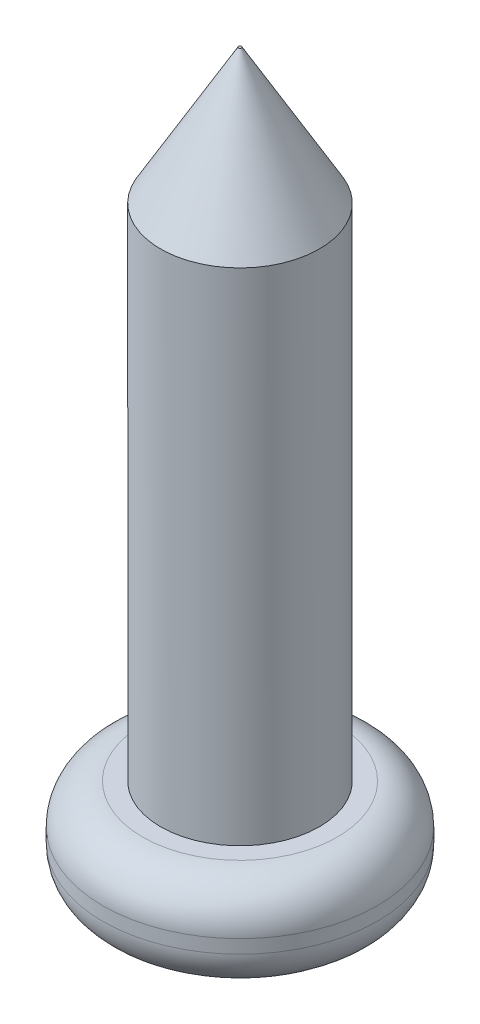
ISO-10303-21;
HEADER;
FILE_DESCRIPTION(('STEP AP214'),'2;1');
FILE_NAME('part.step','',(''),(''),'','','');
FILE_SCHEMA(('AUTOMOTIVE_DESIGN { 1 0 10303 214 1 1 1 1 }'));
ENDSEC;
DATA;
#1=APPLICATION_CONTEXT('core data for automotive mechanical design processes');
#2=APPLICATION_PROTOCOL_DEFINITION('international standard','automotive_design',2000,#1);
#3=PRODUCT_CONTEXT('',#1,'mechanical');
#4=PRODUCT('Part','Part','',(#3));
#5=PRODUCT_RELATED_PRODUCT_CATEGORY('part','',(#4));
#6=PRODUCT_DEFINITION_FORMATION('','',#4);
#7=PRODUCT_DEFINITION_CONTEXT('part definition',#1,'design');
#8=PRODUCT_DEFINITION('design','',#6,#7);
#9=PRODUCT_DEFINITION_SHAPE('','',#8);
#10=(LENGTH_UNIT() NAMED_UNIT(*) SI_UNIT(.MILLI.,.METRE.));
#11=(NAMED_UNIT(*) PLANE_ANGLE_UNIT() SI_UNIT($,.RADIAN.));
#12=(NAMED_UNIT(*) SI_UNIT($,.STERADIAN.) SOLID_ANGLE_UNIT());
#13=UNCERTAINTY_MEASURE_WITH_UNIT(LENGTH_MEASURE(1.E-05),#10,'distance_accuracy_value','');
#14=(GEOMETRIC_REPRESENTATION_CONTEXT(3) GLOBAL_UNCERTAINTY_ASSIGNED_CONTEXT((#13)) GLOBAL_UNIT_ASSIGNED_CONTEXT((#10,
#11,#12)) REPRESENTATION_CONTEXT('',''));
#15=CARTESIAN_POINT('',(0.,0.,0.));
#16=DIRECTION('',(0.,0.,1.));
#17=DIRECTION('',(1.,0.,0.));
#18=AXIS2_PLACEMENT_3D('',#15,#16,#17);
#19=CARTESIAN_POINT('',(0.,1.17,0.));
#20=DIRECTION('',(0.,-1.,0.));
#21=DIRECTION('',(0.,0.,-1.));
#22=AXIS2_PLACEMENT_3D('',#19,#20,#21);
#23=CYLINDRICAL_SURFACE('',#22,1.725);
#24=CARTESIAN_POINT('',(0.,0.5,0.));
#25=DIRECTION('',(0.,1.,0.));
#26=DIRECTION('',(0.,0.,1.));
#27=AXIS2_PLACEMENT_3D('',#24,#25,#26);
#28=CIRCLE('',#27,1.725);
#29=CARTESIAN_POINT('',(0.,0.5,-1.725));
#30=VERTEX_POINT('',#29);
#31=EDGE_CURVE('E54',#30,#30,#28,.T.);
#32=CARTESIAN_POINT('',(0.,0.67,0.));
#33=DIRECTION('',(0.,1.,0.));
#34=DIRECTION('',(0.,0.,1.));
#35=AXIS2_PLACEMENT_3D('',#32,#33,#34);
#36=CIRCLE('',#35,1.725);
#37=CARTESIAN_POINT('',(0.,0.67,-1.725));
#38=VERTEX_POINT('',#37);
#39=EDGE_CURVE('E57',#38,#38,#36,.F.);
#40=CARTESIAN_POINT('',(0.,0.5,-1.725));
#41=CARTESIAN_POINT('',(0.,0.501770833333333,-1.725));
#42=CARTESIAN_POINT('',(0.,0.503541666666667,-1.725));
#43=CARTESIAN_POINT('',(0.,0.507083333333333,-1.725));
#44=CARTESIAN_POINT('',(0.,0.508854166666667,-1.725));
#45=CARTESIAN_POINT('',(0.,0.512395833333333,-1.725));
#46=CARTESIAN_POINT('',(0.,0.514166666666667,-1.725));
#47=CARTESIAN_POINT('',(0.,0.517708333333333,-1.725));
#48=CARTESIAN_POINT('',(0.,0.519479166666667,-1.725));
#49=CARTESIAN_POINT('',(0.,0.523020833333333,-1.725));
#50=CARTESIAN_POINT('',(0.,0.524791666666667,-1.725));
#51=CARTESIAN_POINT('',(0.,0.528333333333333,-1.725));
#52=CARTESIAN_POINT('',(0.,0.530104166666667,-1.725));
#53=CARTESIAN_POINT('',(0.,0.533645833333333,-1.725));
#54=CARTESIAN_POINT('',(0.,0.535416666666667,-1.725));
#55=CARTESIAN_POINT('',(0.,0.538958333333333,-1.725));
#56=CARTESIAN_POINT('',(0.,0.540729166666667,-1.725));
#57=CARTESIAN_POINT('',(0.,0.544270833333333,-1.725));
#58=CARTESIAN_POINT('',(0.,0.546041666666667,-1.725));
#59=CARTESIAN_POINT('',(0.,0.549583333333333,-1.725));
#60=CARTESIAN_POINT('',(0.,0.551354166666667,-1.725));
#61=CARTESIAN_POINT('',(0.,0.554895833333333,-1.725));
#62=CARTESIAN_POINT('',(0.,0.556666666666667,-1.725));
#63=CARTESIAN_POINT('',(0.,0.560208333333333,-1.725));
#64=CARTESIAN_POINT('',(0.,0.561979166666667,-1.725));
#65=CARTESIAN_POINT('',(0.,0.565520833333333,-1.725));
#66=CARTESIAN_POINT('',(0.,0.567291666666667,-1.725));
#67=CARTESIAN_POINT('',(0.,0.570833333333333,-1.725));
#68=CARTESIAN_POINT('',(0.,0.572604166666667,-1.725));
#69=CARTESIAN_POINT('',(0.,0.576145833333333,-1.725));
#70=CARTESIAN_POINT('',(0.,0.577916666666667,-1.725));
#71=CARTESIAN_POINT('',(0.,0.581458333333333,-1.725));
#72=CARTESIAN_POINT('',(0.,0.583229166666667,-1.725));
#73=CARTESIAN_POINT('',(0.,0.586770833333333,-1.725));
#74=CARTESIAN_POINT('',(0.,0.588541666666667,-1.725));
#75=CARTESIAN_POINT('',(0.,0.592083333333333,-1.725));
#76=CARTESIAN_POINT('',(0.,0.593854166666667,-1.725));
#77=CARTESIAN_POINT('',(0.,0.597395833333333,-1.725));
#78=CARTESIAN_POINT('',(0.,0.599166666666667,-1.725));
#79=CARTESIAN_POINT('',(0.,0.602708333333333,-1.725));
#80=CARTESIAN_POINT('',(0.,0.604479166666667,-1.725));
#81=CARTESIAN_POINT('',(0.,0.608020833333333,-1.725));
#82=CARTESIAN_POINT('',(0.,0.609791666666667,-1.725));
#83=CARTESIAN_POINT('',(0.,0.613333333333333,-1.725));
#84=CARTESIAN_POINT('',(0.,0.615104166666667,-1.725));
#85=CARTESIAN_POINT('',(0.,0.618645833333333,-1.725));
#86=CARTESIAN_POINT('',(0.,0.620416666666667,-1.725));
#87=CARTESIAN_POINT('',(0.,0.623958333333333,-1.725));
#88=CARTESIAN_POINT('',(0.,0.625729166666667,-1.725));
#89=CARTESIAN_POINT('',(0.,0.629270833333333,-1.725));
#90=CARTESIAN_POINT('',(0.,0.631041666666667,-1.725));
#91=CARTESIAN_POINT('',(0.,0.634583333333333,-1.725));
#92=CARTESIAN_POINT('',(0.,0.636354166666667,-1.725));
#93=CARTESIAN_POINT('',(0.,0.639895833333333,-1.725));
#94=CARTESIAN_POINT('',(0.,0.641666666666667,-1.725));
#95=CARTESIAN_POINT('',(0.,0.645208333333333,-1.725));
#96=CARTESIAN_POINT('',(0.,0.646979166666667,-1.725));
#97=CARTESIAN_POINT('',(0.,0.650520833333333,-1.725));
#98=CARTESIAN_POINT('',(0.,0.652291666666667,-1.725));
#99=CARTESIAN_POINT('',(0.,0.655833333333333,-1.725));
#100=CARTESIAN_POINT('',(0.,0.657604166666667,-1.725));
#101=CARTESIAN_POINT('',(0.,0.661145833333333,-1.725));
#102=CARTESIAN_POINT('',(0.,0.662916666666667,-1.725));
#103=CARTESIAN_POINT('',(0.,0.666458333333333,-1.725));
#104=CARTESIAN_POINT('',(0.,0.668229166666667,-1.725));
#105=CARTESIAN_POINT('',(0.,0.67,-1.725));
#106=B_SPLINE_CURVE_WITH_KNOTS('',3,(#40,#41,#42,#43,#44,#45,#46,#47,#48,#49,#50,#51,#52,#53,
#54,#55,#56,#57,#58,#59,#60,#61,#62,#63,#64,#65,#66,#67,#68,#69,#70,#71,#72,#73,#74,#75,#76,#77,
#78,#79,#80,#81,#82,#83,#84,#85,#86,#87,#88,#89,#90,#91,#92,#93,#94,#95,#96,#97,#98,#99,#100,
#101,#102,#103,#104,#105),.UNSPECIFIED.,.F.,.F.,(4,2,2,2,2,2,2,2,2,2,2,2,2,2,2,2,2,2,2,2,2,2,2,
2,2,2,2,2,2,2,2,2,4),(0.,0.0053125,0.010625,0.0159375,0.02125,0.0265625,0.031875,0.0371875,
0.0425,0.0478125,0.053125,0.0584375,0.06375,0.0690625,0.074375,0.0796875,0.085,0.0903125,
0.095625,0.1009375,0.10625,0.1115625,0.116875,0.1221875,0.1275,0.1328125,0.138125,0.1434375,
0.14875,0.1540625,0.159375,0.1646875,0.17),.UNSPECIFIED.);
#107=EDGE_CURVE('BSEAM33',#30,#38,#106,.T.);
#108=ORIENTED_EDGE('',*,*,#31,.T.);
#109=ORIENTED_EDGE('',*,*,#39,.T.);
#110=ORIENTED_EDGE('',*,*,#107,.T.);
#111=ORIENTED_EDGE('',*,*,#107,.F.);
#112=EDGE_LOOP('',(#108,#110,#109,#111));
#113=FACE_BOUND('',#112,.T.);
#114=ADVANCED_FACE('F33',(#113),#23,.T.);
#115=CARTESIAN_POINT('',(0.,1.17,0.));
#116=DIRECTION('',(0.,1.,0.));
#117=DIRECTION('',(0.,0.,1.));
#118=AXIS2_PLACEMENT_3D('',#115,#116,#117);
#119=PLANE('',#118);
#120=CARTESIAN_POINT('',(0.,1.17,0.));
#121=DIRECTION('',(0.,1.,0.));
#122=DIRECTION('',(0.,0.,1.));
#123=AXIS2_PLACEMENT_3D('',#120,#121,#122);
#124=CIRCLE('',#123,1.);
#125=CARTESIAN_POINT('',(0.,1.17,1.));
#126=VERTEX_POINT('',#125);
#127=EDGE_CURVE('E60',#126,#126,#124,.T.);
#128=ORIENTED_EDGE('',*,*,#127,.F.);
#129=EDGE_LOOP('',(#128));
#130=FACE_BOUND('',#129,.T.);
#131=CARTESIAN_POINT('',(0.,1.17,0.));
#132=DIRECTION('',(0.,1.,0.));
#133=DIRECTION('',(0.,0.,1.));
#134=AXIS2_PLACEMENT_3D('',#131,#132,#133);
#135=CIRCLE('',#134,1.225);
#136=CARTESIAN_POINT('',(0.,1.17,1.225));
#137=VERTEX_POINT('',#136);
#138=EDGE_CURVE('E45',#137,#137,#135,.T.);
#139=ORIENTED_EDGE('',*,*,#138,.T.);
#140=EDGE_LOOP('',(#139));
#141=FACE_BOUND('',#140,.T.);
#142=ADVANCED_FACE('F66',(#130,#141),#119,.T.);
#143=CARTESIAN_POINT('',(0.,0.,0.));
#144=DIRECTION('',(0.,1.,0.));
#145=DIRECTION('',(0.,0.,1.));
#146=AXIS2_PLACEMENT_3D('',#143,#144,#145);
#147=PLANE('',#146);
#148=CARTESIAN_POINT('',(0.,0.,0.));
#149=DIRECTION('',(0.,1.,0.));
#150=DIRECTION('',(0.,0.,1.));
#151=AXIS2_PLACEMENT_3D('',#148,#149,#150);
#152=CIRCLE('',#151,1.225);
#153=CARTESIAN_POINT('',(0.,0.,1.225));
#154=VERTEX_POINT('',#153);
#155=EDGE_CURVE('E49',#154,#154,#152,.F.);
#156=ORIENTED_EDGE('',*,*,#155,.T.);
#157=EDGE_LOOP('',(#156));
#158=FACE_BOUND('',#157,.T.);
#159=ADVANCED_FACE('F69',(#158),#147,.F.);
#160=CARTESIAN_POINT('',(0.,0.5,0.));
#161=DIRECTION('',(0.,1.,0.));
#162=DIRECTION('',(0.,0.,1.));
#163=AXIS2_PLACEMENT_3D('',#160,#161,#162);
#164=TOROIDAL_SURFACE('',#163,1.225,0.5);
#165=ORIENTED_EDGE('',*,*,#155,.F.);
#166=EDGE_LOOP('',(#165));
#167=FACE_BOUND('',#166,.T.);
#168=ORIENTED_EDGE('',*,*,#31,.F.);
#169=EDGE_LOOP('',(#168));
#170=FACE_BOUND('',#169,.T.);
#171=ADVANCED_FACE('F75',(#167,#170),#164,.T.);
#172=CARTESIAN_POINT('',(0.,0.67,0.));
#173=DIRECTION('',(0.,1.,0.));
#174=DIRECTION('',(0.,0.,1.));
#175=AXIS2_PLACEMENT_3D('',#172,#173,#174);
#176=TOROIDAL_SURFACE('',#175,1.225,0.5);
#177=ORIENTED_EDGE('',*,*,#39,.F.);
#178=EDGE_LOOP('',(#177));
#179=FACE_BOUND('',#178,.T.);
#180=ORIENTED_EDGE('',*,*,#138,.F.);
#181=EDGE_LOOP('',(#180));
#182=FACE_BOUND('',#181,.T.);
#183=ADVANCED_FACE('F73',(#179,#182),#176,.T.);
#184=CARTESIAN_POINT('',(0.,9.17,0.));
#185=DIRECTION('',(0.,-1.,0.));
#186=DIRECTION('',(0.,0.,-1.));
#187=AXIS2_PLACEMENT_3D('',#184,#185,#186);
#188=CYLINDRICAL_SURFACE('',#187,1.);
#189=CARTESIAN_POINT('',(0.,7.46999999999999,0.));
#190=DIRECTION('',(0.,1.,0.));
#191=DIRECTION('',(0.,0.,1.));
#192=AXIS2_PLACEMENT_3D('',#189,#190,#191);
#193=CIRCLE('',#192,1.);
#194=CARTESIAN_POINT('',(0.,7.46999999999999,-1.));
#195=VERTEX_POINT('',#194);
#196=EDGE_CURVE('E10',#195,#195,#193,.F.);
#197=ORIENTED_EDGE('',*,*,#196,.T.);
#198=EDGE_LOOP('',(#197));
#199=FACE_BOUND('',#198,.T.);
#200=ORIENTED_EDGE('',*,*,#127,.T.);
#201=EDGE_LOOP('',(#200));
#202=FACE_BOUND('',#201,.T.);
#203=ADVANCED_FACE('F64',(#199,#202),#188,.T.);
#204=CARTESIAN_POINT('',(0.,9.17,0.));
#205=DIRECTION('',(0.,1.,0.));
#206=DIRECTION('',(0.,0.,1.));
#207=AXIS2_PLACEMENT_3D('',#204,#205,#206);
#208=PLANE('',#207);
#209=CARTESIAN_POINT('',(0.,9.17,0.));
#210=DIRECTION('',(0.,1.,0.));
#211=DIRECTION('',(0.,0.,1.));
#212=AXIS2_PLACEMENT_3D('',#209,#210,#211);
#213=CIRCLE('',#212,0.0185045423776349);
#214=CARTESIAN_POINT('',(0.,9.17,-0.0185045423776354));
#215=VERTEX_POINT('',#214);
#216=EDGE_CURVE('E41',#215,#215,#213,.T.);
#217=ORIENTED_EDGE('',*,*,#216,.T.);
#218=EDGE_LOOP('',(#217));
#219=FACE_BOUND('',#218,.T.);
#220=ADVANCED_FACE('F81',(#219),#208,.T.);
#221=CARTESIAN_POINT('',(0.,9.17,0.));
#222=DIRECTION('',(0.,-1.,0.));
#223=DIRECTION('',(0.,0.,-1.));
#224=AXIS2_PLACEMENT_3D('',#221,#222,#223);
#225=CONICAL_SURFACE('',#224,0.0185045423776349,0.523598775598297);
#226=CARTESIAN_POINT('',(0.,7.46999999999999,-1.));
#227=CARTESIAN_POINT('',(0.,7.48770833333332,-0.989776088983101));
#228=CARTESIAN_POINT('',(0.,7.50541666666666,-0.979552177966201));
#229=CARTESIAN_POINT('',(0.,7.54083333333332,-0.959104355932402));
#230=CARTESIAN_POINT('',(0.,7.55854166666666,-0.948880444915502));
#231=CARTESIAN_POINT('',(0.,7.59395833333332,-0.928432622881703));
#232=CARTESIAN_POINT('',(0.,7.61166666666666,-0.918208711864803));
#233=CARTESIAN_POINT('',(0.,7.64708333333332,-0.897760889831004));
#234=CARTESIAN_POINT('',(0.,7.66479166666666,-0.887536978814104));
#235=CARTESIAN_POINT('',(0.,7.70020833333332,-0.867089156780305));
#236=CARTESIAN_POINT('',(0.,7.71791666666666,-0.856865245763405));
#237=CARTESIAN_POINT('',(0.,7.75333333333332,-0.836417423729606));
#238=CARTESIAN_POINT('',(0.,7.77104166666666,-0.826193512712706));
#239=CARTESIAN_POINT('',(0.,7.80645833333332,-0.805745690678907));
#240=CARTESIAN_POINT('',(0.,7.82416666666666,-0.795521779662007));
#241=CARTESIAN_POINT('',(0.,7.85958333333332,-0.775073957628208));
#242=CARTESIAN_POINT('',(0.,7.87729166666666,-0.764850046611309));
#243=CARTESIAN_POINT('',(0.,7.91270833333333,-0.74440222457751));
#244=CARTESIAN_POINT('',(0.,7.93041666666666,-0.73417831356061));
#245=CARTESIAN_POINT('',(0.,7.96583333333332,-0.71373049152681));
#246=CARTESIAN_POINT('',(0.,7.98354166666666,-0.703506580509911));
#247=CARTESIAN_POINT('',(0.,8.01895833333333,-0.683058758476112));
#248=CARTESIAN_POINT('',(0.,8.03666666666666,-0.672834847459212));
#249=CARTESIAN_POINT('',(0.,8.07208333333332,-0.652387025425413));
#250=CARTESIAN_POINT('',(0.,8.08979166666666,-0.642163114408513));
#251=CARTESIAN_POINT('',(0.,8.12520833333333,-0.621715292374714));
#252=CARTESIAN_POINT('',(0.,8.14291666666666,-0.611491381357814));
#253=CARTESIAN_POINT('',(0.,8.17833333333333,-0.591043559324015));
#254=CARTESIAN_POINT('',(0.,8.19604166666666,-0.580819648307115));
#255=CARTESIAN_POINT('',(0.,8.23145833333333,-0.560371826273316));
#256=CARTESIAN_POINT('',(0.,8.24916666666666,-0.550147915256416));
#257=CARTESIAN_POINT('',(0.,8.28458333333333,-0.529700093222617));
#258=CARTESIAN_POINT('',(0.,8.30229166666666,-0.519476182205717));
#259=CARTESIAN_POINT('',(0.,8.33770833333333,-0.499028360171918));
#260=CARTESIAN_POINT('',(0.,8.35541666666666,-0.488804449155018));
#261=CARTESIAN_POINT('',(0.,8.39083333333333,-0.468356627121219));
#262=CARTESIAN_POINT('',(0.,8.40854166666666,-0.45813271610432));
#263=CARTESIAN_POINT('',(0.,8.44395833333333,-0.43768489407052));
#264=CARTESIAN_POINT('',(0.,8.46166666666666,-0.427460983053621));
#265=CARTESIAN_POINT('',(0.,8.49708333333333,-0.407013161019821));
#266=CARTESIAN_POINT('',(0.,8.51479166666666,-0.396789250002922));
#267=CARTESIAN_POINT('',(0.,8.55020833333333,-0.376341427969123));
#268=CARTESIAN_POINT('',(0.,8.56791666666666,-0.366117516952223));
#269=CARTESIAN_POINT('',(0.,8.60333333333333,-0.345669694918424));
#270=CARTESIAN_POINT('',(0.,8.62104166666666,-0.335445783901524));
#271=CARTESIAN_POINT('',(0.,8.65645833333333,-0.314997961867725));
#272=CARTESIAN_POINT('',(0.,8.67416666666666,-0.304774050850825));
#273=CARTESIAN_POINT('',(0.,8.70958333333333,-0.284326228817026));
#274=CARTESIAN_POINT('',(0.,8.72729166666666,-0.274102317800126));
#275=CARTESIAN_POINT('',(0.,8.76270833333333,-0.253654495766327));
#276=CARTESIAN_POINT('',(0.,8.78041666666666,-0.243430584749427));
#277=CARTESIAN_POINT('',(0.,8.81583333333333,-0.222982762715628));
#278=CARTESIAN_POINT('',(0.,8.83354166666667,-0.212758851698728));
#279=CARTESIAN_POINT('',(0.,8.86895833333333,-0.192311029664929));
#280=CARTESIAN_POINT('',(0.,8.88666666666667,-0.18208711864803));
#281=CARTESIAN_POINT('',(0.,8.92208333333333,-0.16163929661423));
#282=CARTESIAN_POINT('',(0.,8.93979166666666,-0.15141538559733));
#283=CARTESIAN_POINT('',(0.,8.97520833333333,-0.130967563563531));
#284=CARTESIAN_POINT('',(0.,8.99291666666667,-0.120743652546632));
#285=CARTESIAN_POINT('',(0.,9.02833333333333,-0.100295830512833));
#286=CARTESIAN_POINT('',(0.,9.04604166666667,-0.0900719194959328));
#287=CARTESIAN_POINT('',(0.,9.08145833333333,-0.0696240974621334));
#288=CARTESIAN_POINT('',(0.,9.09916666666667,-0.0594001864452339));
#289=CARTESIAN_POINT('',(0.,9.13458333333333,-0.0389523644114348));
#290=CARTESIAN_POINT('',(0.,9.15229166666667,-0.0287284533945353));
#291=CARTESIAN_POINT('',(0.,9.17,-0.0185045423776354));
#292=B_SPLINE_CURVE_WITH_KNOTS('',3,(#226,#227,#228,#229,#230,#231,#232,#233,#234,#235,#236,
#237,#238,#239,#240,#241,#242,#243,#244,#245,#246,#247,#248,#249,#250,#251,#252,#253,#254,#255,
#256,#257,#258,#259,#260,#261,#262,#263,#264,#265,#266,#267,#268,#269,#270,#271,#272,#273,#274,
#275,#276,#277,#278,#279,#280,#281,#282,#283,#284,#285,#286,#287,#288,#289,#290,#291),
.UNSPECIFIED.,.F.,.F.,(4,2,2,2,2,2,2,2,2,2,2,2,2,2,2,2,2,2,2,2,2,2,2,2,2,2,2,2,2,2,2,2,4),(0.,
0.0613434661013988,0.122686932202797,0.184030398304195,0.245373864405593,0.30671733050699,
0.368060796608389,0.429404262709786,0.490747728811185,0.552091194912582,0.613434661013981,
0.674778127115378,0.736121593216777,0.797465059318176,0.858808525419573,0.920151991520971,
0.981495457622369,1.04283892372377,1.10418238982517,1.16552585592656,1.22686932202796,
1.28821278812936,1.34955625423076,1.41089972033216,1.47224318643355,1.53358665253495,
1.59493011863635,1.65627358473775,1.71761705083915,1.77896051694054,1.84030398304194,
1.90164744914334,1.96299091524474),.UNSPECIFIED.);
#293=EDGE_CURVE('BSEAM36',#195,#215,#292,.T.);
#294=ORIENTED_EDGE('',*,*,#196,.F.);
#295=ORIENTED_EDGE('',*,*,#216,.F.);
#296=ORIENTED_EDGE('',*,*,#293,.T.);
#297=ORIENTED_EDGE('',*,*,#293,.F.);
#298=EDGE_LOOP('',(#294,#296,#295,#297));
#299=FACE_BOUND('',#298,.T.);
#300=ADVANCED_FACE('F36',(#299),#225,.T.);
#301=CLOSED_SHELL('',(#114,#142,#159,#171,#183,#203,#220,#300));
#302=MANIFOLD_SOLID_BREP('B2',#301);
#303=ADVANCED_BREP_SHAPE_REPRESENTATION('',(#18,#302),#14);
#304=SHAPE_DEFINITION_REPRESENTATION(#9,#303);
ENDSEC;
END-ISO-10303-21;
